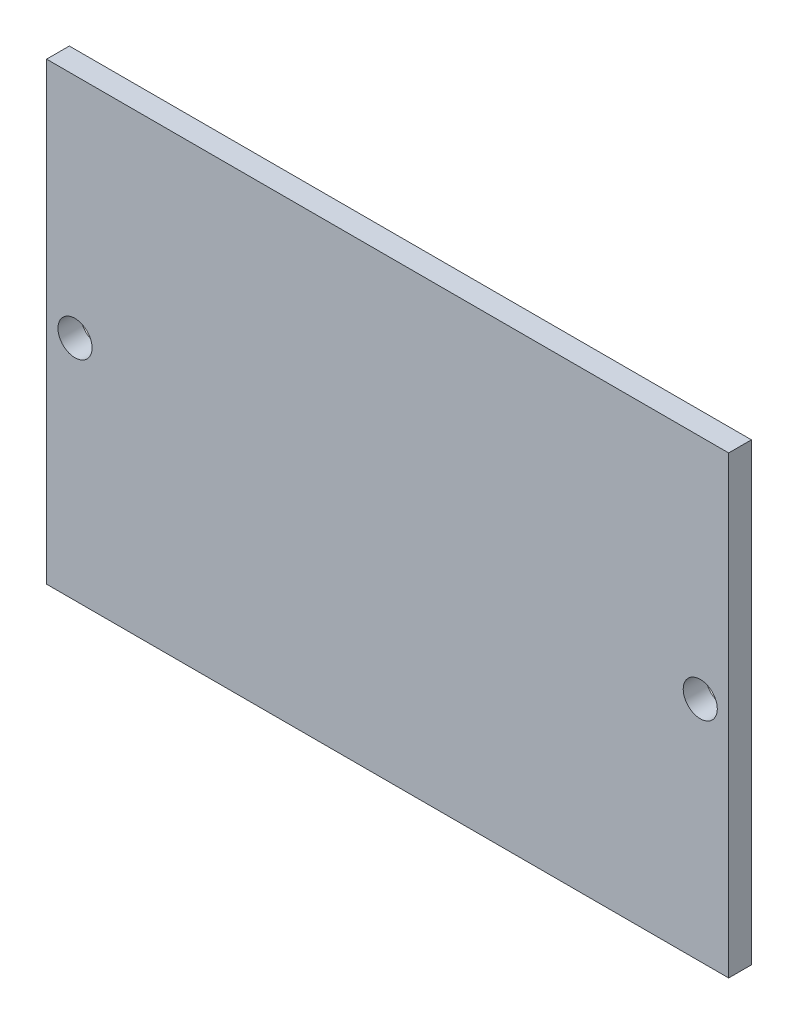
ISO-10303-21;
HEADER;
FILE_DESCRIPTION(('STEP AP214'),'2;1');
FILE_NAME('part.step','',(''),(''),'','','');
FILE_SCHEMA(('AUTOMOTIVE_DESIGN { 1 0 10303 214 1 1 1 1 }'));
ENDSEC;
DATA;
#1=APPLICATION_CONTEXT('core data for automotive mechanical design processes');
#2=APPLICATION_PROTOCOL_DEFINITION('international standard','automotive_design',2000,#1);
#3=PRODUCT_CONTEXT('',#1,'mechanical');
#4=PRODUCT('Part','Part','',(#3));
#5=PRODUCT_RELATED_PRODUCT_CATEGORY('part','',(#4));
#6=PRODUCT_DEFINITION_FORMATION('','',#4);
#7=PRODUCT_DEFINITION_CONTEXT('part definition',#1,'design');
#8=PRODUCT_DEFINITION('design','',#6,#7);
#9=PRODUCT_DEFINITION_SHAPE('','',#8);
#10=(LENGTH_UNIT() NAMED_UNIT(*) SI_UNIT(.MILLI.,.METRE.));
#11=(NAMED_UNIT(*) PLANE_ANGLE_UNIT() SI_UNIT($,.RADIAN.));
#12=(NAMED_UNIT(*) SI_UNIT($,.STERADIAN.) SOLID_ANGLE_UNIT());
#13=UNCERTAINTY_MEASURE_WITH_UNIT(LENGTH_MEASURE(1.E-05),#10,'distance_accuracy_value','');
#14=(GEOMETRIC_REPRESENTATION_CONTEXT(3) GLOBAL_UNCERTAINTY_ASSIGNED_CONTEXT((#13)) GLOBAL_UNIT_ASSIGNED_CONTEXT((#10,
#11,#12)) REPRESENTATION_CONTEXT('',''));
#15=CARTESIAN_POINT('',(0.,0.,0.));
#16=DIRECTION('',(0.,0.,1.));
#17=DIRECTION('',(1.,0.,0.));
#18=AXIS2_PLACEMENT_3D('',#15,#16,#17);
#19=CARTESIAN_POINT('',(30.,20.,2.));
#20=DIRECTION('',(-1.,0.,0.));
#21=DIRECTION('',(0.,-1.,0.));
#22=AXIS2_PLACEMENT_3D('',#19,#20,#21);
#23=PLANE('',#22);
#24=DIRECTION('',(0.,1.,0.));
#25=VECTOR('',#24,1.);
#26=CARTESIAN_POINT('',(30.,20.,0.));
#27=LINE('',#26,#25);
#28=CARTESIAN_POINT('',(30.,-20.,0.));
#29=VERTEX_POINT('',#28);
#30=CARTESIAN_POINT('',(30.,20.,0.));
#31=VERTEX_POINT('',#30);
#32=EDGE_CURVE('E107',#29,#31,#27,.T.);
#33=ORIENTED_EDGE('',*,*,#32,.T.);
#34=DIRECTION('',(0.,0.,-1.));
#35=VECTOR('',#34,1.);
#36=CARTESIAN_POINT('',(30.,20.,2.));
#37=LINE('',#36,#35);
#38=CARTESIAN_POINT('',(30.,20.,2.));
#39=VERTEX_POINT('',#38);
#40=EDGE_CURVE('E11',#39,#31,#37,.T.);
#41=ORIENTED_EDGE('',*,*,#40,.F.);
#42=DIRECTION('',(0.,1.,0.));
#43=VECTOR('',#42,1.);
#44=CARTESIAN_POINT('',(30.,20.,2.));
#45=LINE('',#44,#43);
#46=CARTESIAN_POINT('',(30.,-20.,2.));
#47=VERTEX_POINT('',#46);
#48=EDGE_CURVE('E91',#47,#39,#45,.T.);
#49=ORIENTED_EDGE('',*,*,#48,.F.);
#50=DIRECTION('',(0.,0.,-1.));
#51=VECTOR('',#50,1.);
#52=CARTESIAN_POINT('',(30.,-20.,2.));
#53=LINE('',#52,#51);
#54=EDGE_CURVE('E103',#47,#29,#53,.T.);
#55=ORIENTED_EDGE('',*,*,#54,.T.);
#56=EDGE_LOOP('',(#33,#41,#49,#55));
#57=FACE_BOUND('',#56,.T.);
#58=ADVANCED_FACE('F39',(#57),#23,.F.);
#59=CARTESIAN_POINT('',(-30.,20.,2.));
#60=DIRECTION('',(0.,-1.,0.));
#61=DIRECTION('',(0.,0.,-1.));
#62=AXIS2_PLACEMENT_3D('',#59,#60,#61);
#63=PLANE('',#62);
#64=DIRECTION('',(-1.,0.,0.));
#65=VECTOR('',#64,1.);
#66=CARTESIAN_POINT('',(-30.,20.,0.));
#67=LINE('',#66,#65);
#68=CARTESIAN_POINT('',(-30.,20.,0.));
#69=VERTEX_POINT('',#68);
#70=EDGE_CURVE('E96',#31,#69,#67,.T.);
#71=ORIENTED_EDGE('',*,*,#70,.T.);
#72=DIRECTION('',(0.,0.,-1.));
#73=VECTOR('',#72,1.);
#74=CARTESIAN_POINT('',(-30.,20.,2.));
#75=LINE('',#74,#73);
#76=CARTESIAN_POINT('',(-30.,20.,2.));
#77=VERTEX_POINT('',#76);
#78=EDGE_CURVE('E48',#77,#69,#75,.T.);
#79=ORIENTED_EDGE('',*,*,#78,.F.);
#80=DIRECTION('',(-1.,0.,0.));
#81=VECTOR('',#80,1.);
#82=CARTESIAN_POINT('',(-30.,20.,2.));
#83=LINE('',#82,#81);
#84=EDGE_CURVE('E86',#39,#77,#83,.T.);
#85=ORIENTED_EDGE('',*,*,#84,.F.);
#86=ORIENTED_EDGE('',*,*,#40,.T.);
#87=EDGE_LOOP('',(#71,#79,#85,#86));
#88=FACE_BOUND('',#87,.T.);
#89=ADVANCED_FACE('F95',(#88),#63,.F.);
#90=CARTESIAN_POINT('',(-30.,20.,2.));
#91=DIRECTION('',(1.,0.,0.));
#92=DIRECTION('',(0.,1.,0.));
#93=AXIS2_PLACEMENT_3D('',#90,#91,#92);
#94=PLANE('',#93);
#95=DIRECTION('',(0.,-1.,0.));
#96=VECTOR('',#95,1.);
#97=CARTESIAN_POINT('',(-30.,20.,0.));
#98=LINE('',#97,#96);
#99=CARTESIAN_POINT('',(-30.,-20.,0.));
#100=VERTEX_POINT('',#99);
#101=EDGE_CURVE('E73',#69,#100,#98,.T.);
#102=ORIENTED_EDGE('',*,*,#101,.T.);
#103=DIRECTION('',(0.,0.,-1.));
#104=VECTOR('',#103,1.);
#105=CARTESIAN_POINT('',(-30.,-20.,2.));
#106=LINE('',#105,#104);
#107=CARTESIAN_POINT('',(-30.,-20.,2.));
#108=VERTEX_POINT('',#107);
#109=EDGE_CURVE('E98',#108,#100,#106,.T.);
#110=ORIENTED_EDGE('',*,*,#109,.F.);
#111=DIRECTION('',(0.,-1.,0.));
#112=VECTOR('',#111,1.);
#113=CARTESIAN_POINT('',(-30.,20.,2.));
#114=LINE('',#113,#112);
#115=EDGE_CURVE('E89',#77,#108,#114,.T.);
#116=ORIENTED_EDGE('',*,*,#115,.F.);
#117=ORIENTED_EDGE('',*,*,#78,.T.);
#118=EDGE_LOOP('',(#102,#110,#116,#117));
#119=FACE_BOUND('',#118,.T.);
#120=ADVANCED_FACE('F99',(#119),#94,.F.);
#121=CARTESIAN_POINT('',(-30.,-20.,2.));
#122=DIRECTION('',(0.,1.,0.));
#123=DIRECTION('',(0.,0.,1.));
#124=AXIS2_PLACEMENT_3D('',#121,#122,#123);
#125=PLANE('',#124);
#126=DIRECTION('',(1.,0.,0.));
#127=VECTOR('',#126,1.);
#128=CARTESIAN_POINT('',(-30.,-20.,0.));
#129=LINE('',#128,#127);
#130=EDGE_CURVE('E79',#100,#29,#129,.T.);
#131=ORIENTED_EDGE('',*,*,#130,.T.);
#132=ORIENTED_EDGE('',*,*,#54,.F.);
#133=DIRECTION('',(1.,0.,0.));
#134=VECTOR('',#133,1.);
#135=CARTESIAN_POINT('',(-30.,-20.,2.));
#136=LINE('',#135,#134);
#137=EDGE_CURVE('E56',#108,#47,#136,.T.);
#138=ORIENTED_EDGE('',*,*,#137,.F.);
#139=ORIENTED_EDGE('',*,*,#109,.T.);
#140=EDGE_LOOP('',(#131,#132,#138,#139));
#141=FACE_BOUND('',#140,.T.);
#142=ADVANCED_FACE('F121',(#141),#125,.F.);
#143=CARTESIAN_POINT('',(0.,0.,2.));
#144=DIRECTION('',(0.,0.,1.));
#145=DIRECTION('',(1.,0.,0.));
#146=AXIS2_PLACEMENT_3D('',#143,#144,#145);
#147=PLANE('',#146);
#148=CARTESIAN_POINT('',(-27.5,0.,2.));
#149=DIRECTION('',(0.,0.,1.));
#150=DIRECTION('',(1.,0.,0.));
#151=AXIS2_PLACEMENT_3D('',#148,#149,#150);
#152=CIRCLE('',#151,1.5);
#153=CARTESIAN_POINT('',(-26.,0.,2.));
#154=VERTEX_POINT('',#153);
#155=EDGE_CURVE('E136',#154,#154,#152,.F.);
#156=ORIENTED_EDGE('',*,*,#155,.T.);
#157=EDGE_LOOP('',(#156));
#158=FACE_BOUND('',#157,.T.);
#159=CARTESIAN_POINT('',(27.5,0.,2.));
#160=DIRECTION('',(0.,0.,1.));
#161=DIRECTION('',(1.,0.,0.));
#162=AXIS2_PLACEMENT_3D('',#159,#160,#161);
#163=CIRCLE('',#162,1.5);
#164=CARTESIAN_POINT('',(29.,0.,2.));
#165=VERTEX_POINT('',#164);
#166=EDGE_CURVE('E128',#165,#165,#163,.F.);
#167=ORIENTED_EDGE('',*,*,#166,.T.);
#168=EDGE_LOOP('',(#167));
#169=FACE_BOUND('',#168,.T.);
#170=ORIENTED_EDGE('',*,*,#48,.T.);
#171=ORIENTED_EDGE('',*,*,#84,.T.);
#172=ORIENTED_EDGE('',*,*,#115,.T.);
#173=ORIENTED_EDGE('',*,*,#137,.T.);
#174=EDGE_LOOP('',(#170,#171,#172,#173));
#175=FACE_BOUND('',#174,.T.);
#176=ADVANCED_FACE('F87',(#158,#169,#175),#147,.T.);
#177=CARTESIAN_POINT('',(0.,0.,0.));
#178=DIRECTION('',(0.,0.,1.));
#179=DIRECTION('',(1.,0.,0.));
#180=AXIS2_PLACEMENT_3D('',#177,#178,#179);
#181=PLANE('',#180);
#182=CARTESIAN_POINT('',(-27.5,0.,0.));
#183=DIRECTION('',(0.,0.,-1.));
#184=DIRECTION('',(-1.,0.,0.));
#185=AXIS2_PLACEMENT_3D('',#182,#183,#184);
#186=CIRCLE('',#185,1.5);
#187=CARTESIAN_POINT('',(-29.,0.,0.));
#188=VERTEX_POINT('',#187);
#189=EDGE_CURVE('E111',#188,#188,#186,.T.);
#190=ORIENTED_EDGE('',*,*,#189,.F.);
#191=EDGE_LOOP('',(#190));
#192=FACE_BOUND('',#191,.T.);
#193=CARTESIAN_POINT('',(27.5,0.,0.));
#194=DIRECTION('',(0.,0.,-1.));
#195=DIRECTION('',(-1.,0.,0.));
#196=AXIS2_PLACEMENT_3D('',#193,#194,#195);
#197=CIRCLE('',#196,1.5);
#198=CARTESIAN_POINT('',(26.,0.,0.));
#199=VERTEX_POINT('',#198);
#200=EDGE_CURVE('E132',#199,#199,#197,.T.);
#201=ORIENTED_EDGE('',*,*,#200,.F.);
#202=EDGE_LOOP('',(#201));
#203=FACE_BOUND('',#202,.T.);
#204=ORIENTED_EDGE('',*,*,#32,.F.);
#205=ORIENTED_EDGE('',*,*,#130,.F.);
#206=ORIENTED_EDGE('',*,*,#101,.F.);
#207=ORIENTED_EDGE('',*,*,#70,.F.);
#208=EDGE_LOOP('',(#204,#205,#206,#207));
#209=FACE_BOUND('',#208,.T.);
#210=ADVANCED_FACE('F124',(#192,#203,#209),#181,.F.);
#211=CARTESIAN_POINT('',(27.5,0.,2.001));
#212=DIRECTION('',(0.,0.,-1.));
#213=DIRECTION('',(-1.,0.,0.));
#214=AXIS2_PLACEMENT_3D('',#211,#212,#213);
#215=CYLINDRICAL_SURFACE('',#214,1.5);
#216=ORIENTED_EDGE('',*,*,#166,.F.);
#217=EDGE_LOOP('',(#216));
#218=FACE_BOUND('',#217,.T.);
#219=ORIENTED_EDGE('',*,*,#200,.T.);
#220=EDGE_LOOP('',(#219));
#221=FACE_BOUND('',#220,.T.);
#222=ADVANCED_FACE('F148',(#218,#221),#215,.F.);
#223=CARTESIAN_POINT('',(-27.5,0.,2.001));
#224=DIRECTION('',(0.,0.,-1.));
#225=DIRECTION('',(-1.,0.,0.));
#226=AXIS2_PLACEMENT_3D('',#223,#224,#225);
#227=CYLINDRICAL_SURFACE('',#226,1.5);
#228=ORIENTED_EDGE('',*,*,#155,.F.);
#229=EDGE_LOOP('',(#228));
#230=FACE_BOUND('',#229,.T.);
#231=ORIENTED_EDGE('',*,*,#189,.T.);
#232=EDGE_LOOP('',(#231));
#233=FACE_BOUND('',#232,.T.);
#234=ADVANCED_FACE('F144',(#230,#233),#227,.F.);
#235=CLOSED_SHELL('',(#58,#89,#120,#142,#176,#210,#222,#234));
#236=MANIFOLD_SOLID_BREP('B2',#235);
#237=ADVANCED_BREP_SHAPE_REPRESENTATION('',(#18,#236),#14);
#238=SHAPE_DEFINITION_REPRESENTATION(#9,#237);
ENDSEC;
END-ISO-10303-21;
